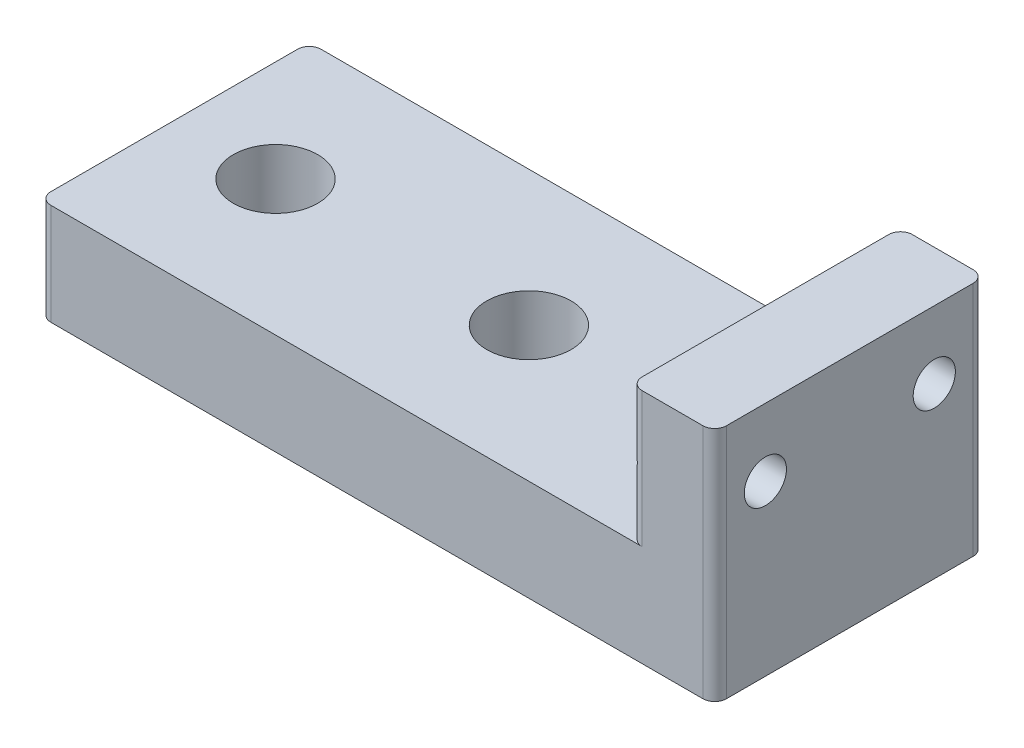
ISO-10303-21;
HEADER;
FILE_DESCRIPTION(('STEP AP214'),'2;1');
FILE_NAME('part.step','',(''),(''),'','','');
FILE_SCHEMA(('AUTOMOTIVE_DESIGN { 1 0 10303 214 1 1 1 1 }'));
ENDSEC;
DATA;
#1=APPLICATION_CONTEXT('core data for automotive mechanical design processes');
#2=APPLICATION_PROTOCOL_DEFINITION('international standard','automotive_design',2000,#1);
#3=PRODUCT_CONTEXT('',#1,'mechanical');
#4=PRODUCT('Part','Part','',(#3));
#5=PRODUCT_RELATED_PRODUCT_CATEGORY('part','',(#4));
#6=PRODUCT_DEFINITION_FORMATION('','',#4);
#7=PRODUCT_DEFINITION_CONTEXT('part definition',#1,'design');
#8=PRODUCT_DEFINITION('design','',#6,#7);
#9=PRODUCT_DEFINITION_SHAPE('','',#8);
#10=(LENGTH_UNIT() NAMED_UNIT(*) SI_UNIT(.MILLI.,.METRE.));
#11=(NAMED_UNIT(*) PLANE_ANGLE_UNIT() SI_UNIT($,.RADIAN.));
#12=(NAMED_UNIT(*) SI_UNIT($,.STERADIAN.) SOLID_ANGLE_UNIT());
#13=UNCERTAINTY_MEASURE_WITH_UNIT(LENGTH_MEASURE(1.E-05),#10,'distance_accuracy_value','');
#14=(GEOMETRIC_REPRESENTATION_CONTEXT(3) GLOBAL_UNCERTAINTY_ASSIGNED_CONTEXT((#13)) GLOBAL_UNIT_ASSIGNED_CONTEXT((#10,
#11,#12)) REPRESENTATION_CONTEXT('',''));
#15=CARTESIAN_POINT('',(0.,0.,0.));
#16=DIRECTION('',(0.,0.,1.));
#17=DIRECTION('',(1.,0.,0.));
#18=AXIS2_PLACEMENT_3D('',#15,#16,#17);
#19=CARTESIAN_POINT('',(49.,10.,-13.));
#20=DIRECTION('',(-1.,0.,0.));
#21=DIRECTION('',(0.,0.,1.));
#22=AXIS2_PLACEMENT_3D('',#19,#20,#21);
#23=CYLINDRICAL_SURFACE('',#22,1.25);
#24=CARTESIAN_POINT('',(40.,10.,-13.));
#25=DIRECTION('',(-1.,0.,0.));
#26=DIRECTION('',(0.,0.,1.));
#27=AXIS2_PLACEMENT_3D('',#24,#25,#26);
#28=CIRCLE('',#27,1.25);
#29=CARTESIAN_POINT('',(40.,10.,-11.75));
#30=VERTEX_POINT('',#29);
#31=EDGE_CURVE('E360',#30,#30,#28,.T.);
#32=ORIENTED_EDGE('',*,*,#31,.F.);
#33=EDGE_LOOP('',(#32));
#34=FACE_BOUND('',#33,.T.);
#35=CARTESIAN_POINT('',(38.,10.,-13.));
#36=DIRECTION('',(-1.,0.,0.));
#37=DIRECTION('',(0.,0.,1.));
#38=AXIS2_PLACEMENT_3D('',#35,#36,#37);
#39=CIRCLE('',#38,1.25);
#40=CARTESIAN_POINT('',(38.,10.,-11.75));
#41=VERTEX_POINT('',#40);
#42=EDGE_CURVE('E46',#41,#41,#39,.F.);
#43=ORIENTED_EDGE('',*,*,#42,.F.);
#44=EDGE_LOOP('',(#43));
#45=FACE_BOUND('',#44,.T.);
#46=ADVANCED_FACE('F42',(#34,#45),#23,.F.);
#47=CARTESIAN_POINT('',(49.,10.,-3.));
#48=DIRECTION('',(-1.,0.,0.));
#49=DIRECTION('',(0.,0.,1.));
#50=AXIS2_PLACEMENT_3D('',#47,#48,#49);
#51=CYLINDRICAL_SURFACE('',#50,1.25);
#52=CARTESIAN_POINT('',(40.,10.,-3.));
#53=DIRECTION('',(-1.,0.,0.));
#54=DIRECTION('',(0.,0.,1.));
#55=AXIS2_PLACEMENT_3D('',#52,#53,#54);
#56=CIRCLE('',#55,1.25);
#57=CARTESIAN_POINT('',(40.,10.,-1.75));
#58=VERTEX_POINT('',#57);
#59=EDGE_CURVE('E364',#58,#58,#56,.T.);
#60=ORIENTED_EDGE('',*,*,#59,.F.);
#61=EDGE_LOOP('',(#60));
#62=FACE_BOUND('',#61,.T.);
#63=CARTESIAN_POINT('',(38.,10.,-3.));
#64=DIRECTION('',(-1.,0.,0.));
#65=DIRECTION('',(0.,0.,1.));
#66=AXIS2_PLACEMENT_3D('',#63,#64,#65);
#67=CIRCLE('',#66,1.25);
#68=CARTESIAN_POINT('',(38.,10.,-1.75));
#69=VERTEX_POINT('',#68);
#70=EDGE_CURVE('E283',#69,#69,#67,.F.);
#71=ORIENTED_EDGE('',*,*,#70,.F.);
#72=EDGE_LOOP('',(#71));
#73=FACE_BOUND('',#72,.T.);
#74=ADVANCED_FACE('F530',(#62,#73),#51,.F.);
#75=CARTESIAN_POINT('',(0.,6.,0.));
#76=DIRECTION('',(0.,1.,0.));
#77=DIRECTION('',(0.,0.,1.));
#78=AXIS2_PLACEMENT_3D('',#75,#76,#77);
#79=PLANE('',#78);
#80=CARTESIAN_POINT('',(21.,6.,-8.));
#81=DIRECTION('',(0.,1.,0.));
#82=DIRECTION('',(0.,0.,1.));
#83=AXIS2_PLACEMENT_3D('',#80,#81,#82);
#84=CIRCLE('',#83,2.5);
#85=CARTESIAN_POINT('',(21.,6.,-5.5));
#86=VERTEX_POINT('',#85);
#87=EDGE_CURVE('E369',#86,#86,#84,.T.);
#88=ORIENTED_EDGE('',*,*,#87,.F.);
#89=EDGE_LOOP('',(#88));
#90=FACE_BOUND('',#89,.T.);
#91=CARTESIAN_POINT('',(6.,6.,-8.));
#92=DIRECTION('',(0.,1.,0.));
#93=DIRECTION('',(0.,0.,1.));
#94=AXIS2_PLACEMENT_3D('',#91,#92,#93);
#95=CIRCLE('',#94,2.5);
#96=CARTESIAN_POINT('',(6.,6.,-5.5));
#97=VERTEX_POINT('',#96);
#98=EDGE_CURVE('E368',#97,#97,#95,.T.);
#99=ORIENTED_EDGE('',*,*,#98,.F.);
#100=EDGE_LOOP('',(#99));
#101=FACE_BOUND('',#100,.T.);
#102=DIRECTION('',(1.,0.,0.));
#103=VECTOR('',#102,1.);
#104=CARTESIAN_POINT('',(0.,6.,-16.));
#105=LINE('',#104,#103);
#106=CARTESIAN_POINT('',(0.7,6.,-16.));
#107=VERTEX_POINT('',#106);
#108=CARTESIAN_POINT('',(35.7,6.,-16.));
#109=VERTEX_POINT('',#108);
#110=EDGE_CURVE('E402',#107,#109,#105,.T.);
#111=ORIENTED_EDGE('',*,*,#110,.F.);
#112=CARTESIAN_POINT('',(0.7,6.,-15.3));
#113=DIRECTION('',(0.,1.,0.));
#114=DIRECTION('',(0.,0.,1.));
#115=AXIS2_PLACEMENT_3D('',#112,#113,#114);
#116=CIRCLE('',#115,0.7);
#117=CARTESIAN_POINT('',(0.,6.,-15.3));
#118=VERTEX_POINT('',#117);
#119=EDGE_CURVE('E462',#107,#118,#116,.T.);
#120=ORIENTED_EDGE('',*,*,#119,.T.);
#121=DIRECTION('',(0.,0.,-1.));
#122=VECTOR('',#121,1.);
#123=CARTESIAN_POINT('',(0.,6.,0.));
#124=LINE('',#123,#122);
#125=CARTESIAN_POINT('',(0.,6.,-0.7));
#126=VERTEX_POINT('',#125);
#127=EDGE_CURVE('E406',#126,#118,#124,.T.);
#128=ORIENTED_EDGE('',*,*,#127,.F.);
#129=CARTESIAN_POINT('',(0.7,6.,-0.7));
#130=DIRECTION('',(0.,1.,0.));
#131=DIRECTION('',(0.,0.,1.));
#132=AXIS2_PLACEMENT_3D('',#129,#130,#131);
#133=CIRCLE('',#132,0.7);
#134=CARTESIAN_POINT('',(0.7,6.,0.));
#135=VERTEX_POINT('',#134);
#136=EDGE_CURVE('E459',#126,#135,#133,.T.);
#137=ORIENTED_EDGE('',*,*,#136,.T.);
#138=DIRECTION('',(1.,0.,0.));
#139=VECTOR('',#138,1.);
#140=CARTESIAN_POINT('',(0.,6.,0.));
#141=LINE('',#140,#139);
#142=CARTESIAN_POINT('',(35.7,6.,0.));
#143=VERTEX_POINT('',#142);
#144=EDGE_CURVE('E399',#135,#143,#141,.T.);
#145=ORIENTED_EDGE('',*,*,#144,.T.);
#146=CARTESIAN_POINT('',(35.7,6.,-0.7));
#147=DIRECTION('',(0.,1.,0.));
#148=DIRECTION('',(0.,0.,1.));
#149=AXIS2_PLACEMENT_3D('',#146,#147,#148);
#150=CIRCLE('',#149,0.7);
#151=CARTESIAN_POINT('',(35.,6.,-0.7));
#152=VERTEX_POINT('',#151);
#153=EDGE_CURVE('E509',#143,#152,#150,.F.);
#154=ORIENTED_EDGE('',*,*,#153,.T.);
#155=DIRECTION('',(0.,0.,-1.));
#156=VECTOR('',#155,1.);
#157=CARTESIAN_POINT('',(35.,6.,0.));
#158=LINE('',#157,#156);
#159=CARTESIAN_POINT('',(35.,6.,-15.3));
#160=VERTEX_POINT('',#159);
#161=EDGE_CURVE('E394',#152,#160,#158,.T.);
#162=ORIENTED_EDGE('',*,*,#161,.T.);
#163=CARTESIAN_POINT('',(35.7,6.,-15.3));
#164=DIRECTION('',(0.,1.,0.));
#165=DIRECTION('',(0.,0.,1.));
#166=AXIS2_PLACEMENT_3D('',#163,#164,#165);
#167=CIRCLE('',#166,0.7);
#168=EDGE_CURVE('E505',#160,#109,#167,.F.);
#169=ORIENTED_EDGE('',*,*,#168,.T.);
#170=EDGE_LOOP('',(#111,#120,#128,#137,#145,#154,#162,#169));
#171=FACE_BOUND('',#170,.T.);
#172=ADVANCED_FACE('F536',(#90,#101,#171),#79,.T.);
#173=CARTESIAN_POINT('',(0.,6.,0.));
#174=DIRECTION('',(0.,0.,-1.));
#175=DIRECTION('',(-1.,0.,0.));
#176=AXIS2_PLACEMENT_3D('',#173,#174,#175);
#177=PLANE('',#176);
#178=ORIENTED_EDGE('',*,*,#144,.F.);
#179=DIRECTION('',(0.,-1.,0.));
#180=VECTOR('',#179,1.);
#181=CARTESIAN_POINT('',(0.7,0.,0.));
#182=LINE('',#181,#180);
#183=CARTESIAN_POINT('',(0.7,0.,0.));
#184=VERTEX_POINT('',#183);
#185=EDGE_CURVE('E472',#135,#184,#182,.T.);
#186=ORIENTED_EDGE('',*,*,#185,.T.);
#187=DIRECTION('',(1.,0.,0.));
#188=VECTOR('',#187,1.);
#189=CARTESIAN_POINT('',(0.,0.,0.));
#190=LINE('',#189,#188);
#191=CARTESIAN_POINT('',(39.3,0.,0.));
#192=VERTEX_POINT('',#191);
#193=EDGE_CURVE('E398',#184,#192,#190,.T.);
#194=ORIENTED_EDGE('',*,*,#193,.T.);
#195=DIRECTION('',(0.,-1.,0.));
#196=VECTOR('',#195,1.);
#197=CARTESIAN_POINT('',(39.3,6.,0.));
#198=LINE('',#197,#196);
#199=CARTESIAN_POINT('',(39.3,14.,0.));
#200=VERTEX_POINT('',#199);
#201=EDGE_CURVE('E465',#192,#200,#198,.F.);
#202=ORIENTED_EDGE('',*,*,#201,.T.);
#203=DIRECTION('',(1.,0.,0.));
#204=VECTOR('',#203,1.);
#205=CARTESIAN_POINT('',(0.,14.,0.));
#206=LINE('',#205,#204);
#207=CARTESIAN_POINT('',(35.7,14.,0.));
#208=VERTEX_POINT('',#207);
#209=EDGE_CURVE('E386',#208,#200,#206,.T.);
#210=ORIENTED_EDGE('',*,*,#209,.F.);
#211=DIRECTION('',(0.,-1.,0.));
#212=VECTOR('',#211,1.);
#213=CARTESIAN_POINT('',(35.7,6.,0.));
#214=LINE('',#213,#212);
#215=EDGE_CURVE('E468',#208,#143,#214,.T.);
#216=ORIENTED_EDGE('',*,*,#215,.T.);
#217=EDGE_LOOP('',(#178,#186,#194,#202,#210,#216));
#218=FACE_BOUND('',#217,.T.);
#219=ADVANCED_FACE('F562',(#218),#177,.F.);
#220=CARTESIAN_POINT('',(40.,6.,0.));
#221=DIRECTION('',(-1.,0.,0.));
#222=DIRECTION('',(0.,0.,1.));
#223=AXIS2_PLACEMENT_3D('',#220,#221,#222);
#224=PLANE('',#223);
#225=ORIENTED_EDGE('',*,*,#59,.T.);
#226=EDGE_LOOP('',(#225));
#227=FACE_BOUND('',#226,.T.);
#228=ORIENTED_EDGE('',*,*,#31,.T.);
#229=EDGE_LOOP('',(#228));
#230=FACE_BOUND('',#229,.T.);
#231=DIRECTION('',(0.,0.,-1.));
#232=VECTOR('',#231,1.);
#233=CARTESIAN_POINT('',(40.,0.,0.));
#234=LINE('',#233,#232);
#235=CARTESIAN_POINT('',(40.,0.,-0.7));
#236=VERTEX_POINT('',#235);
#237=CARTESIAN_POINT('',(40.,0.,-15.3));
#238=VERTEX_POINT('',#237);
#239=EDGE_CURVE('E414',#236,#238,#234,.T.);
#240=ORIENTED_EDGE('',*,*,#239,.T.);
#241=DIRECTION('',(0.,-1.,0.));
#242=VECTOR('',#241,1.);
#243=CARTESIAN_POINT('',(40.,14.,-15.3));
#244=LINE('',#243,#242);
#245=CARTESIAN_POINT('',(40.,14.,-15.3));
#246=VERTEX_POINT('',#245);
#247=EDGE_CURVE('E502',#238,#246,#244,.F.);
#248=ORIENTED_EDGE('',*,*,#247,.T.);
#249=DIRECTION('',(0.,0.,-1.));
#250=VECTOR('',#249,1.);
#251=CARTESIAN_POINT('',(40.,14.,0.));
#252=LINE('',#251,#250);
#253=CARTESIAN_POINT('',(40.,14.,-0.7));
#254=VERTEX_POINT('',#253);
#255=EDGE_CURVE('E390',#254,#246,#252,.T.);
#256=ORIENTED_EDGE('',*,*,#255,.F.);
#257=DIRECTION('',(0.,-1.,0.));
#258=VECTOR('',#257,1.);
#259=CARTESIAN_POINT('',(40.,6.,-0.7));
#260=LINE('',#259,#258);
#261=EDGE_CURVE('E498',#254,#236,#260,.T.);
#262=ORIENTED_EDGE('',*,*,#261,.T.);
#263=EDGE_LOOP('',(#240,#248,#256,#262));
#264=FACE_BOUND('',#263,.T.);
#265=ADVANCED_FACE('F574',(#227,#230,#264),#224,.F.);
#266=CARTESIAN_POINT('',(0.,6.,-16.));
#267=DIRECTION('',(0.,0.,-1.));
#268=DIRECTION('',(-1.,0.,0.));
#269=AXIS2_PLACEMENT_3D('',#266,#267,#268);
#270=PLANE('',#269);
#271=DIRECTION('',(1.,0.,0.));
#272=VECTOR('',#271,1.);
#273=CARTESIAN_POINT('',(0.,0.,-16.));
#274=LINE('',#273,#272);
#275=CARTESIAN_POINT('',(0.7,0.,-16.));
#276=VERTEX_POINT('',#275);
#277=CARTESIAN_POINT('',(39.3,0.,-16.));
#278=VERTEX_POINT('',#277);
#279=EDGE_CURVE('E418',#276,#278,#274,.T.);
#280=ORIENTED_EDGE('',*,*,#279,.F.);
#281=DIRECTION('',(0.,-1.,0.));
#282=VECTOR('',#281,1.);
#283=CARTESIAN_POINT('',(0.7,6.,-16.));
#284=LINE('',#283,#282);
#285=EDGE_CURVE('E456',#276,#107,#284,.F.);
#286=ORIENTED_EDGE('',*,*,#285,.T.);
#287=ORIENTED_EDGE('',*,*,#110,.T.);
#288=DIRECTION('',(0.,-1.,0.));
#289=VECTOR('',#288,1.);
#290=CARTESIAN_POINT('',(35.7,14.,-16.));
#291=LINE('',#290,#289);
#292=CARTESIAN_POINT('',(35.7,14.,-16.));
#293=VERTEX_POINT('',#292);
#294=EDGE_CURVE('E453',#109,#293,#291,.F.);
#295=ORIENTED_EDGE('',*,*,#294,.T.);
#296=DIRECTION('',(1.,0.,0.));
#297=VECTOR('',#296,1.);
#298=CARTESIAN_POINT('',(0.,14.,-16.));
#299=LINE('',#298,#297);
#300=CARTESIAN_POINT('',(39.3,14.,-16.));
#301=VERTEX_POINT('',#300);
#302=EDGE_CURVE('E377',#293,#301,#299,.T.);
#303=ORIENTED_EDGE('',*,*,#302,.T.);
#304=DIRECTION('',(0.,-1.,0.));
#305=VECTOR('',#304,1.);
#306=CARTESIAN_POINT('',(39.3,0.,-16.));
#307=LINE('',#306,#305);
#308=EDGE_CURVE('E449',#301,#278,#307,.T.);
#309=ORIENTED_EDGE('',*,*,#308,.T.);
#310=EDGE_LOOP('',(#280,#286,#287,#295,#303,#309));
#311=FACE_BOUND('',#310,.T.);
#312=ADVANCED_FACE('F570',(#311),#270,.T.);
#313=CARTESIAN_POINT('',(0.,6.,0.));
#314=DIRECTION('',(-1.,0.,0.));
#315=DIRECTION('',(0.,0.,1.));
#316=AXIS2_PLACEMENT_3D('',#313,#314,#315);
#317=PLANE('',#316);
#318=ORIENTED_EDGE('',*,*,#127,.T.);
#319=DIRECTION('',(0.,-1.,0.));
#320=VECTOR('',#319,1.);
#321=CARTESIAN_POINT('',(0.,6.,-15.3));
#322=LINE('',#321,#320);
#323=CARTESIAN_POINT('',(0.,0.,-15.3));
#324=VERTEX_POINT('',#323);
#325=EDGE_CURVE('E433',#118,#324,#322,.T.);
#326=ORIENTED_EDGE('',*,*,#325,.T.);
#327=DIRECTION('',(0.,0.,-1.));
#328=VECTOR('',#327,1.);
#329=CARTESIAN_POINT('',(0.,0.,0.));
#330=LINE('',#329,#328);
#331=CARTESIAN_POINT('',(0.,0.,-0.7));
#332=VERTEX_POINT('',#331);
#333=EDGE_CURVE('E403',#332,#324,#330,.T.);
#334=ORIENTED_EDGE('',*,*,#333,.F.);
#335=DIRECTION('',(0.,-1.,0.));
#336=VECTOR('',#335,1.);
#337=CARTESIAN_POINT('',(0.,6.,-0.7));
#338=LINE('',#337,#336);
#339=EDGE_CURVE('E410',#332,#126,#338,.F.);
#340=ORIENTED_EDGE('',*,*,#339,.T.);
#341=EDGE_LOOP('',(#318,#326,#334,#340));
#342=FACE_BOUND('',#341,.T.);
#343=ADVANCED_FACE('F566',(#342),#317,.T.);
#344=CARTESIAN_POINT('',(0.,0.,0.));
#345=DIRECTION('',(0.,1.,0.));
#346=DIRECTION('',(0.,0.,1.));
#347=AXIS2_PLACEMENT_3D('',#344,#345,#346);
#348=PLANE('',#347);
#349=CARTESIAN_POINT('',(21.,0.,-8.));
#350=DIRECTION('',(0.,1.,0.));
#351=DIRECTION('',(0.,0.,1.));
#352=AXIS2_PLACEMENT_3D('',#349,#350,#351);
#353=CIRCLE('',#352,2.5);
#354=CARTESIAN_POINT('',(21.,0.,-5.5));
#355=VERTEX_POINT('',#354);
#356=EDGE_CURVE('E382',#355,#355,#353,.T.);
#357=ORIENTED_EDGE('',*,*,#356,.T.);
#358=EDGE_LOOP('',(#357));
#359=FACE_BOUND('',#358,.T.);
#360=CARTESIAN_POINT('',(6.,0.,-8.));
#361=DIRECTION('',(0.,1.,0.));
#362=DIRECTION('',(0.,0.,1.));
#363=AXIS2_PLACEMENT_3D('',#360,#361,#362);
#364=CIRCLE('',#363,2.5);
#365=CARTESIAN_POINT('',(6.,0.,-5.5));
#366=VERTEX_POINT('',#365);
#367=EDGE_CURVE('E373',#366,#366,#364,.T.);
#368=ORIENTED_EDGE('',*,*,#367,.T.);
#369=EDGE_LOOP('',(#368));
#370=FACE_BOUND('',#369,.T.);
#371=ORIENTED_EDGE('',*,*,#333,.T.);
#372=CARTESIAN_POINT('',(0.7,0.,-15.3));
#373=DIRECTION('',(0.,1.,0.));
#374=DIRECTION('',(0.,0.,1.));
#375=AXIS2_PLACEMENT_3D('',#372,#373,#374);
#376=CIRCLE('',#375,0.7);
#377=EDGE_CURVE('E446',#324,#276,#376,.F.);
#378=ORIENTED_EDGE('',*,*,#377,.T.);
#379=ORIENTED_EDGE('',*,*,#279,.T.);
#380=CARTESIAN_POINT('',(39.3,0.,-15.3));
#381=DIRECTION('',(0.,1.,0.));
#382=DIRECTION('',(0.,0.,1.));
#383=AXIS2_PLACEMENT_3D('',#380,#381,#382);
#384=CIRCLE('',#383,0.7);
#385=EDGE_CURVE('E440',#278,#238,#384,.F.);
#386=ORIENTED_EDGE('',*,*,#385,.T.);
#387=ORIENTED_EDGE('',*,*,#239,.F.);
#388=CARTESIAN_POINT('',(39.3,0.,-0.7));
#389=DIRECTION('',(0.,1.,0.));
#390=DIRECTION('',(0.,0.,1.));
#391=AXIS2_PLACEMENT_3D('',#388,#389,#390);
#392=CIRCLE('',#391,0.7);
#393=EDGE_CURVE('E437',#236,#192,#392,.F.);
#394=ORIENTED_EDGE('',*,*,#393,.T.);
#395=ORIENTED_EDGE('',*,*,#193,.F.);
#396=CARTESIAN_POINT('',(0.7,0.,-0.7));
#397=DIRECTION('',(0.,1.,0.));
#398=DIRECTION('',(0.,0.,1.));
#399=AXIS2_PLACEMENT_3D('',#396,#397,#398);
#400=CIRCLE('',#399,0.7);
#401=EDGE_CURVE('E443',#184,#332,#400,.F.);
#402=ORIENTED_EDGE('',*,*,#401,.T.);
#403=EDGE_LOOP('',(#371,#378,#379,#386,#387,#394,#395,#402));
#404=FACE_BOUND('',#403,.T.);
#405=ADVANCED_FACE('F558',(#359,#370,#404),#348,.F.);
#406=CARTESIAN_POINT('',(35.,14.,0.));
#407=DIRECTION('',(1.,0.,0.));
#408=DIRECTION('',(0.,0.,-1.));
#409=AXIS2_PLACEMENT_3D('',#406,#407,#408);
#410=PLANE('',#409);
#411=DIRECTION('',(0.,0.,1.));
#412=VECTOR('',#411,1.);
#413=CARTESIAN_POINT('',(35.,7.5,-14.4433756729741));
#414=LINE('',#413,#412);
#415=CARTESIAN_POINT('',(35.,7.5,-14.4433756729741));
#416=VERTEX_POINT('',#415);
#417=CARTESIAN_POINT('',(35.,7.5,-11.5566243270259));
#418=VERTEX_POINT('',#417);
#419=EDGE_CURVE('E253',#416,#418,#414,.T.);
#420=ORIENTED_EDGE('',*,*,#419,.F.);
#421=DIRECTION('',(0.,-0.866025403784438,0.5));
#422=VECTOR('',#421,1.);
#423=CARTESIAN_POINT('',(35.,10.,-15.8867513459481));
#424=LINE('',#423,#422);
#425=CARTESIAN_POINT('',(35.,8.98371685740842,-15.3));
#426=VERTEX_POINT('',#425);
#427=EDGE_CURVE('E274',#426,#416,#424,.T.);
#428=ORIENTED_EDGE('',*,*,#427,.F.);
#429=DIRECTION('',(0.,-1.,0.));
#430=VECTOR('',#429,1.);
#431=CARTESIAN_POINT('',(35.,6.,-15.3));
#432=LINE('',#431,#430);
#433=EDGE_CURVE('E481',#426,#160,#432,.T.);
#434=ORIENTED_EDGE('',*,*,#433,.T.);
#435=ORIENTED_EDGE('',*,*,#161,.F.);
#436=DIRECTION('',(0.,-1.,0.));
#437=VECTOR('',#436,1.);
#438=CARTESIAN_POINT('',(35.,14.,-0.7));
#439=LINE('',#438,#437);
#440=CARTESIAN_POINT('',(35.,8.9837168574084,-0.7));
#441=VERTEX_POINT('',#440);
#442=EDGE_CURVE('E477',#152,#441,#439,.F.);
#443=ORIENTED_EDGE('',*,*,#442,.T.);
#444=DIRECTION('',(0.,0.866025403784439,0.5));
#445=VECTOR('',#444,1.);
#446=CARTESIAN_POINT('',(35.,7.5,-1.55662432702593));
#447=LINE('',#446,#445);
#448=CARTESIAN_POINT('',(35.,7.5,-1.55662432702593));
#449=VERTEX_POINT('',#448);
#450=EDGE_CURVE('E68',#449,#441,#447,.T.);
#451=ORIENTED_EDGE('',*,*,#450,.F.);
#452=DIRECTION('',(0.,0.,1.));
#453=VECTOR('',#452,1.);
#454=CARTESIAN_POINT('',(35.,7.49999999999999,-4.44337567297406));
#455=LINE('',#454,#453);
#456=CARTESIAN_POINT('',(35.,7.49999999999999,-4.44337567297406));
#457=VERTEX_POINT('',#456);
#458=EDGE_CURVE('E335',#457,#449,#455,.T.);
#459=ORIENTED_EDGE('',*,*,#458,.F.);
#460=DIRECTION('',(0.,-0.866025403784439,0.5));
#461=VECTOR('',#460,1.);
#462=CARTESIAN_POINT('',(35.,10.,-5.88675134594813));
#463=LINE('',#462,#461);
#464=CARTESIAN_POINT('',(35.,10.,-5.88675134594813));
#465=VERTEX_POINT('',#464);
#466=EDGE_CURVE('E331',#465,#457,#463,.T.);
#467=ORIENTED_EDGE('',*,*,#466,.F.);
#468=DIRECTION('',(0.,-0.866025403784439,-0.5));
#469=VECTOR('',#468,1.);
#470=CARTESIAN_POINT('',(35.,12.5,-4.44337567297406));
#471=LINE('',#470,#469);
#472=CARTESIAN_POINT('',(35.,12.5,-4.44337567297406));
#473=VERTEX_POINT('',#472);
#474=EDGE_CURVE('E327',#473,#465,#471,.T.);
#475=ORIENTED_EDGE('',*,*,#474,.F.);
#476=DIRECTION('',(0.,0.,-1.));
#477=VECTOR('',#476,1.);
#478=CARTESIAN_POINT('',(35.,12.5,-1.55662432702593));
#479=LINE('',#478,#477);
#480=CARTESIAN_POINT('',(35.,12.5,-1.55662432702593));
#481=VERTEX_POINT('',#480);
#482=EDGE_CURVE('E323',#481,#473,#479,.T.);
#483=ORIENTED_EDGE('',*,*,#482,.F.);
#484=DIRECTION('',(0.,0.866025403784438,-0.500000000000001));
#485=VECTOR('',#484,1.);
#486=CARTESIAN_POINT('',(35.,10.,-0.113248654051863));
#487=LINE('',#486,#485);
#488=CARTESIAN_POINT('',(35.,11.0162831425916,-0.7));
#489=VERTEX_POINT('',#488);
#490=EDGE_CURVE('E302',#489,#481,#487,.T.);
#491=ORIENTED_EDGE('',*,*,#490,.F.);
#492=CARTESIAN_POINT('',(35.,14.,-0.7));
#493=VERTEX_POINT('',#492);
#494=EDGE_CURVE('E476',#489,#493,#439,.F.);
#495=ORIENTED_EDGE('',*,*,#494,.T.);
#496=DIRECTION('',(0.,0.,1.));
#497=VECTOR('',#496,1.);
#498=CARTESIAN_POINT('',(35.,14.,0.));
#499=LINE('',#498,#497);
#500=CARTESIAN_POINT('',(35.,14.,-15.3));
#501=VERTEX_POINT('',#500);
#502=EDGE_CURVE('E381',#501,#493,#499,.T.);
#503=ORIENTED_EDGE('',*,*,#502,.F.);
#504=CARTESIAN_POINT('',(35.,11.0162831425916,-15.3));
#505=VERTEX_POINT('',#504);
#506=EDGE_CURVE('E482',#501,#505,#432,.T.);
#507=ORIENTED_EDGE('',*,*,#506,.T.);
#508=DIRECTION('',(0.,-0.866025403784438,-0.5));
#509=VECTOR('',#508,1.);
#510=CARTESIAN_POINT('',(35.,12.5,-14.4433756729741));
#511=LINE('',#510,#509);
#512=CARTESIAN_POINT('',(35.,12.5,-14.4433756729741));
#513=VERTEX_POINT('',#512);
#514=EDGE_CURVE('E60',#513,#505,#511,.T.);
#515=ORIENTED_EDGE('',*,*,#514,.F.);
#516=DIRECTION('',(0.,0.,-1.));
#517=VECTOR('',#516,1.);
#518=CARTESIAN_POINT('',(35.,12.5,-11.5566243270259));
#519=LINE('',#518,#517);
#520=CARTESIAN_POINT('',(35.,12.5,-11.5566243270259));
#521=VERTEX_POINT('',#520);
#522=EDGE_CURVE('E268',#521,#513,#519,.T.);
#523=ORIENTED_EDGE('',*,*,#522,.F.);
#524=DIRECTION('',(0.,0.866025403784438,-0.5));
#525=VECTOR('',#524,1.);
#526=CARTESIAN_POINT('',(35.,10.,-10.1132486540519));
#527=LINE('',#526,#525);
#528=CARTESIAN_POINT('',(35.,10.,-10.1132486540519));
#529=VERTEX_POINT('',#528);
#530=EDGE_CURVE('E224',#529,#521,#527,.T.);
#531=ORIENTED_EDGE('',*,*,#530,.F.);
#532=DIRECTION('',(0.,0.866025403784439,0.5));
#533=VECTOR('',#532,1.);
#534=CARTESIAN_POINT('',(35.,7.5,-11.5566243270259));
#535=LINE('',#534,#533);
#536=EDGE_CURVE('E246',#418,#529,#535,.T.);
#537=ORIENTED_EDGE('',*,*,#536,.F.);
#538=EDGE_LOOP('',(#420,#428,#434,#435,#443,#451,#459,#467,#475,#483,#491,#495,#503,#507,#515,
#523,#531,#537));
#539=FACE_BOUND('',#538,.T.);
#540=ADVANCED_FACE('F554',(#539),#410,.F.);
#541=CARTESIAN_POINT('',(0.,14.,0.));
#542=DIRECTION('',(0.,1.,0.));
#543=DIRECTION('',(0.,0.,1.));
#544=AXIS2_PLACEMENT_3D('',#541,#542,#543);
#545=PLANE('',#544);
#546=ORIENTED_EDGE('',*,*,#302,.F.);
#547=CARTESIAN_POINT('',(35.7,14.,-15.3));
#548=DIRECTION('',(0.,1.,0.));
#549=DIRECTION('',(0.,0.,1.));
#550=AXIS2_PLACEMENT_3D('',#547,#548,#549);
#551=CIRCLE('',#550,0.7);
#552=EDGE_CURVE('E495',#293,#501,#551,.T.);
#553=ORIENTED_EDGE('',*,*,#552,.T.);
#554=ORIENTED_EDGE('',*,*,#502,.T.);
#555=CARTESIAN_POINT('',(35.7,14.,-0.7));
#556=DIRECTION('',(0.,1.,0.));
#557=DIRECTION('',(0.,0.,1.));
#558=AXIS2_PLACEMENT_3D('',#555,#556,#557);
#559=CIRCLE('',#558,0.7);
#560=EDGE_CURVE('E489',#493,#208,#559,.T.);
#561=ORIENTED_EDGE('',*,*,#560,.T.);
#562=ORIENTED_EDGE('',*,*,#209,.T.);
#563=CARTESIAN_POINT('',(39.3,14.,-0.7));
#564=DIRECTION('',(0.,1.,0.));
#565=DIRECTION('',(0.,0.,1.));
#566=AXIS2_PLACEMENT_3D('',#563,#564,#565);
#567=CIRCLE('',#566,0.7);
#568=EDGE_CURVE('E486',#200,#254,#567,.T.);
#569=ORIENTED_EDGE('',*,*,#568,.T.);
#570=ORIENTED_EDGE('',*,*,#255,.T.);
#571=CARTESIAN_POINT('',(39.3,14.,-15.3));
#572=DIRECTION('',(0.,1.,0.));
#573=DIRECTION('',(0.,0.,1.));
#574=AXIS2_PLACEMENT_3D('',#571,#572,#573);
#575=CIRCLE('',#574,0.7);
#576=EDGE_CURVE('E492',#246,#301,#575,.T.);
#577=ORIENTED_EDGE('',*,*,#576,.T.);
#578=EDGE_LOOP('',(#546,#553,#554,#561,#562,#569,#570,#577));
#579=FACE_BOUND('',#578,.T.);
#580=ADVANCED_FACE('F550',(#579),#545,.T.);
#581=CARTESIAN_POINT('',(6.,-8.,-8.));
#582=DIRECTION('',(0.,1.,0.));
#583=DIRECTION('',(0.,0.,1.));
#584=AXIS2_PLACEMENT_3D('',#581,#582,#583);
#585=CYLINDRICAL_SURFACE('',#584,2.5);
#586=ORIENTED_EDGE('',*,*,#98,.T.);
#587=EDGE_LOOP('',(#586));
#588=FACE_BOUND('',#587,.T.);
#589=ORIENTED_EDGE('',*,*,#367,.F.);
#590=EDGE_LOOP('',(#589));
#591=FACE_BOUND('',#590,.T.);
#592=ADVANCED_FACE('F546',(#588,#591),#585,.F.);
#593=CARTESIAN_POINT('',(21.,-8.,-8.));
#594=DIRECTION('',(0.,1.,0.));
#595=DIRECTION('',(0.,0.,1.));
#596=AXIS2_PLACEMENT_3D('',#593,#594,#595);
#597=CYLINDRICAL_SURFACE('',#596,2.5);
#598=ORIENTED_EDGE('',*,*,#87,.T.);
#599=EDGE_LOOP('',(#598));
#600=FACE_BOUND('',#599,.T.);
#601=ORIENTED_EDGE('',*,*,#356,.F.);
#602=EDGE_LOOP('',(#601));
#603=FACE_BOUND('',#602,.T.);
#604=ADVANCED_FACE('F542',(#600,#603),#597,.F.);
#605=CARTESIAN_POINT('',(0.7,6.,-15.3));
#606=DIRECTION('',(0.,-1.,0.));
#607=DIRECTION('',(0.,0.,-1.));
#608=AXIS2_PLACEMENT_3D('',#605,#606,#607);
#609=CYLINDRICAL_SURFACE('',#608,0.7);
#610=ORIENTED_EDGE('',*,*,#119,.F.);
#611=ORIENTED_EDGE('',*,*,#285,.F.);
#612=ORIENTED_EDGE('',*,*,#377,.F.);
#613=ORIENTED_EDGE('',*,*,#325,.F.);
#614=EDGE_LOOP('',(#610,#611,#612,#613));
#615=FACE_BOUND('',#614,.T.);
#616=ADVANCED_FACE('F545',(#615),#609,.T.);
#617=CARTESIAN_POINT('',(0.7,6.,-0.7));
#618=DIRECTION('',(0.,1.,0.));
#619=DIRECTION('',(0.,0.,1.));
#620=AXIS2_PLACEMENT_3D('',#617,#618,#619);
#621=CYLINDRICAL_SURFACE('',#620,0.7);
#622=ORIENTED_EDGE('',*,*,#136,.F.);
#623=ORIENTED_EDGE('',*,*,#339,.F.);
#624=ORIENTED_EDGE('',*,*,#401,.F.);
#625=ORIENTED_EDGE('',*,*,#185,.F.);
#626=EDGE_LOOP('',(#622,#623,#624,#625));
#627=FACE_BOUND('',#626,.T.);
#628=ADVANCED_FACE('F584',(#627),#621,.T.);
#629=CARTESIAN_POINT('',(35.7,14.,-15.3));
#630=DIRECTION('',(0.,1.,0.));
#631=DIRECTION('',(0.,0.,1.));
#632=AXIS2_PLACEMENT_3D('',#629,#630,#631);
#633=CYLINDRICAL_SURFACE('',#632,0.7);
#634=CARTESIAN_POINT('',(35.7,8.98371685740842,-15.3));
#635=DIRECTION('',(0.,-0.5,-0.866025403784439));
#636=DIRECTION('',(0.,0.866025403784439,-0.5));
#637=AXIS2_PLACEMENT_3D('',#634,#635,#636);
#638=ELLIPSE('',#637,1.4,0.7);
#639=CARTESIAN_POINT('',(35.3182633656196,10.,-15.8867513459481));
#640=VERTEX_POINT('',#639);
#641=EDGE_CURVE('E11',#640,#426,#638,.F.);
#642=ORIENTED_EDGE('',*,*,#641,.F.);
#643=CARTESIAN_POINT('',(35.7,11.0162831425916,-15.3));
#644=DIRECTION('',(0.,0.5,-0.866025403784439));
#645=DIRECTION('',(0.,0.866025403784439,0.5));
#646=AXIS2_PLACEMENT_3D('',#643,#644,#645);
#647=ELLIPSE('',#646,1.4,0.7);
#648=EDGE_CURVE('E52',#505,#640,#647,.F.);
#649=ORIENTED_EDGE('',*,*,#648,.F.);
#650=ORIENTED_EDGE('',*,*,#506,.F.);
#651=ORIENTED_EDGE('',*,*,#552,.F.);
#652=ORIENTED_EDGE('',*,*,#294,.F.);
#653=ORIENTED_EDGE('',*,*,#168,.F.);
#654=ORIENTED_EDGE('',*,*,#433,.F.);
#655=EDGE_LOOP('',(#642,#649,#650,#651,#652,#653,#654));
#656=FACE_BOUND('',#655,.T.);
#657=ADVANCED_FACE('F588',(#656),#633,.T.);
#658=CARTESIAN_POINT('',(39.3,6.,-15.3));
#659=DIRECTION('',(0.,1.,0.));
#660=DIRECTION('',(0.,0.,1.));
#661=AXIS2_PLACEMENT_3D('',#658,#659,#660);
#662=CYLINDRICAL_SURFACE('',#661,0.7);
#663=ORIENTED_EDGE('',*,*,#576,.F.);
#664=ORIENTED_EDGE('',*,*,#247,.F.);
#665=ORIENTED_EDGE('',*,*,#385,.F.);
#666=ORIENTED_EDGE('',*,*,#308,.F.);
#667=EDGE_LOOP('',(#663,#664,#665,#666));
#668=FACE_BOUND('',#667,.T.);
#669=ADVANCED_FACE('F592',(#668),#662,.T.);
#670=CARTESIAN_POINT('',(35.7,6.,-0.7));
#671=DIRECTION('',(0.,-1.,0.));
#672=DIRECTION('',(0.,0.,-1.));
#673=AXIS2_PLACEMENT_3D('',#670,#671,#672);
#674=CYLINDRICAL_SURFACE('',#673,0.7);
#675=CARTESIAN_POINT('',(35.7,11.0162831425916,-0.7));
#676=DIRECTION('',(0.,0.500000000000001,0.866025403784438));
#677=DIRECTION('',(0.,-0.866025403784438,0.500000000000001));
#678=AXIS2_PLACEMENT_3D('',#675,#676,#677);
#679=ELLIPSE('',#678,1.4,0.7);
#680=CARTESIAN_POINT('',(35.3182633656196,10.,-0.113248654051863));
#681=VERTEX_POINT('',#680);
#682=EDGE_CURVE('E515',#681,#489,#679,.F.);
#683=ORIENTED_EDGE('',*,*,#682,.F.);
#684=CARTESIAN_POINT('',(35.7,8.9837168574084,-0.7));
#685=DIRECTION('',(0.,-0.5,0.866025403784438));
#686=DIRECTION('',(0.,-0.866025403784439,-0.5));
#687=AXIS2_PLACEMENT_3D('',#684,#685,#686);
#688=ELLIPSE('',#687,1.4,0.7);
#689=EDGE_CURVE('E512',#441,#681,#688,.F.);
#690=ORIENTED_EDGE('',*,*,#689,.F.);
#691=ORIENTED_EDGE('',*,*,#442,.F.);
#692=ORIENTED_EDGE('',*,*,#153,.F.);
#693=ORIENTED_EDGE('',*,*,#215,.F.);
#694=ORIENTED_EDGE('',*,*,#560,.F.);
#695=ORIENTED_EDGE('',*,*,#494,.F.);
#696=EDGE_LOOP('',(#683,#690,#691,#692,#693,#694,#695));
#697=FACE_BOUND('',#696,.T.);
#698=ADVANCED_FACE('F595',(#697),#674,.T.);
#699=CARTESIAN_POINT('',(39.3,6.,-0.7));
#700=DIRECTION('',(0.,-1.,0.));
#701=DIRECTION('',(0.,0.,-1.));
#702=AXIS2_PLACEMENT_3D('',#699,#700,#701);
#703=CYLINDRICAL_SURFACE('',#702,0.7);
#704=ORIENTED_EDGE('',*,*,#568,.F.);
#705=ORIENTED_EDGE('',*,*,#201,.F.);
#706=ORIENTED_EDGE('',*,*,#393,.F.);
#707=ORIENTED_EDGE('',*,*,#261,.F.);
#708=EDGE_LOOP('',(#704,#705,#706,#707));
#709=FACE_BOUND('',#708,.T.);
#710=ADVANCED_FACE('F44',(#709),#703,.T.);
#711=CARTESIAN_POINT('',(38.,0.,0.));
#712=DIRECTION('',(-1.,0.,0.));
#713=DIRECTION('',(0.,0.,1.));
#714=AXIS2_PLACEMENT_3D('',#711,#712,#713);
#715=PLANE('',#714);
#716=DIRECTION('',(0.,0.,-1.));
#717=VECTOR('',#716,1.);
#718=CARTESIAN_POINT('',(38.,12.5,-1.55662432702593));
#719=LINE('',#718,#717);
#720=CARTESIAN_POINT('',(38.,12.5,-1.55662432702593));
#721=VERTEX_POINT('',#720);
#722=CARTESIAN_POINT('',(38.,12.5,-4.44337567297406));
#723=VERTEX_POINT('',#722);
#724=EDGE_CURVE('E297',#721,#723,#719,.T.);
#725=ORIENTED_EDGE('',*,*,#724,.T.);
#726=DIRECTION('',(0.,-0.866025403784439,-0.5));
#727=VECTOR('',#726,1.);
#728=CARTESIAN_POINT('',(38.,12.5,-4.44337567297406));
#729=LINE('',#728,#727);
#730=CARTESIAN_POINT('',(38.,10.,-5.88675134594813));
#731=VERTEX_POINT('',#730);
#732=EDGE_CURVE('E301',#723,#731,#729,.T.);
#733=ORIENTED_EDGE('',*,*,#732,.T.);
#734=DIRECTION('',(0.,-0.866025403784439,0.5));
#735=VECTOR('',#734,1.);
#736=CARTESIAN_POINT('',(38.,10.,-5.88675134594813));
#737=LINE('',#736,#735);
#738=CARTESIAN_POINT('',(38.,7.49999999999999,-4.44337567297406));
#739=VERTEX_POINT('',#738);
#740=EDGE_CURVE('E306',#731,#739,#737,.T.);
#741=ORIENTED_EDGE('',*,*,#740,.T.);
#742=DIRECTION('',(0.,0.,1.));
#743=VECTOR('',#742,1.);
#744=CARTESIAN_POINT('',(38.,7.49999999999999,-4.44337567297406));
#745=LINE('',#744,#743);
#746=CARTESIAN_POINT('',(38.,7.5,-1.55662432702593));
#747=VERTEX_POINT('',#746);
#748=EDGE_CURVE('E310',#739,#747,#745,.T.);
#749=ORIENTED_EDGE('',*,*,#748,.T.);
#750=DIRECTION('',(0.,0.866025403784439,0.5));
#751=VECTOR('',#750,1.);
#752=CARTESIAN_POINT('',(38.,7.5,-1.55662432702593));
#753=LINE('',#752,#751);
#754=CARTESIAN_POINT('',(38.,10.,-0.113248654051863));
#755=VERTEX_POINT('',#754);
#756=EDGE_CURVE('E314',#747,#755,#753,.T.);
#757=ORIENTED_EDGE('',*,*,#756,.T.);
#758=DIRECTION('',(0.,0.866025403784438,-0.500000000000001));
#759=VECTOR('',#758,1.);
#760=CARTESIAN_POINT('',(38.,10.,-0.113248654051863));
#761=LINE('',#760,#759);
#762=EDGE_CURVE('E318',#755,#721,#761,.T.);
#763=ORIENTED_EDGE('',*,*,#762,.T.);
#764=EDGE_LOOP('',(#725,#733,#741,#749,#757,#763));
#765=FACE_BOUND('',#764,.T.);
#766=ORIENTED_EDGE('',*,*,#70,.T.);
#767=EDGE_LOOP('',(#766));
#768=FACE_BOUND('',#767,.T.);
#769=ADVANCED_FACE('F602',(#765,#768),#715,.T.);
#770=CARTESIAN_POINT('',(38.,12.5,-1.55662432702593));
#771=DIRECTION('',(0.,1.,0.));
#772=DIRECTION('',(0.,0.,1.));
#773=AXIS2_PLACEMENT_3D('',#770,#771,#772);
#774=PLANE('',#773);
#775=ORIENTED_EDGE('',*,*,#482,.T.);
#776=DIRECTION('',(-1.,0.,0.));
#777=VECTOR('',#776,1.);
#778=CARTESIAN_POINT('',(38.,12.5,-4.44337567297406));
#779=LINE('',#778,#777);
#780=EDGE_CURVE('E322',#723,#473,#779,.T.);
#781=ORIENTED_EDGE('',*,*,#780,.F.);
#782=ORIENTED_EDGE('',*,*,#724,.F.);
#783=DIRECTION('',(-1.,0.,0.));
#784=VECTOR('',#783,1.);
#785=CARTESIAN_POINT('',(38.,12.5,-1.55662432702593));
#786=LINE('',#785,#784);
#787=EDGE_CURVE('E269',#721,#481,#786,.T.);
#788=ORIENTED_EDGE('',*,*,#787,.T.);
#789=EDGE_LOOP('',(#775,#781,#782,#788));
#790=FACE_BOUND('',#789,.T.);
#791=ADVANCED_FACE('F618',(#790),#774,.F.);
#792=CARTESIAN_POINT('',(38.,10.,-0.113248654051863));
#793=DIRECTION('',(0.,0.500000000000001,0.866025403784438));
#794=DIRECTION('',(0.,-0.866025403784438,0.500000000000001));
#795=AXIS2_PLACEMENT_3D('',#792,#793,#794);
#796=PLANE('',#795);
#797=ORIENTED_EDGE('',*,*,#682,.T.);
#798=ORIENTED_EDGE('',*,*,#490,.T.);
#799=ORIENTED_EDGE('',*,*,#787,.F.);
#800=ORIENTED_EDGE('',*,*,#762,.F.);
#801=DIRECTION('',(-1.,0.,0.));
#802=VECTOR('',#801,1.);
#803=CARTESIAN_POINT('',(38.,10.,-0.113248654051863));
#804=LINE('',#803,#802);
#805=EDGE_CURVE('E346',#755,#681,#804,.T.);
#806=ORIENTED_EDGE('',*,*,#805,.T.);
#807=EDGE_LOOP('',(#797,#798,#799,#800,#806));
#808=FACE_BOUND('',#807,.T.);
#809=ADVANCED_FACE('F610',(#808),#796,.F.);
#810=CARTESIAN_POINT('',(38.,7.5,-1.55662432702593));
#811=DIRECTION('',(0.,-0.5,0.866025403784438));
#812=DIRECTION('',(0.,-0.866025403784439,-0.5));
#813=AXIS2_PLACEMENT_3D('',#810,#811,#812);
#814=PLANE('',#813);
#815=ORIENTED_EDGE('',*,*,#689,.T.);
#816=ORIENTED_EDGE('',*,*,#805,.F.);
#817=ORIENTED_EDGE('',*,*,#756,.F.);
#818=DIRECTION('',(-1.,0.,0.));
#819=VECTOR('',#818,1.);
#820=CARTESIAN_POINT('',(38.,7.5,-1.55662432702593));
#821=LINE('',#820,#819);
#822=EDGE_CURVE('E350',#747,#449,#821,.T.);
#823=ORIENTED_EDGE('',*,*,#822,.T.);
#824=ORIENTED_EDGE('',*,*,#450,.T.);
#825=EDGE_LOOP('',(#815,#816,#817,#823,#824));
#826=FACE_BOUND('',#825,.T.);
#827=ADVANCED_FACE('F624',(#826),#814,.F.);
#828=CARTESIAN_POINT('',(38.,7.49999999999999,-4.44337567297406));
#829=DIRECTION('',(0.,-1.,0.));
#830=DIRECTION('',(0.,0.,-1.));
#831=AXIS2_PLACEMENT_3D('',#828,#829,#830);
#832=PLANE('',#831);
#833=ORIENTED_EDGE('',*,*,#458,.T.);
#834=ORIENTED_EDGE('',*,*,#822,.F.);
#835=ORIENTED_EDGE('',*,*,#748,.F.);
#836=DIRECTION('',(-1.,0.,0.));
#837=VECTOR('',#836,1.);
#838=CARTESIAN_POINT('',(38.,7.49999999999999,-4.44337567297406));
#839=LINE('',#838,#837);
#840=EDGE_CURVE('E353',#739,#457,#839,.T.);
#841=ORIENTED_EDGE('',*,*,#840,.T.);
#842=EDGE_LOOP('',(#833,#834,#835,#841));
#843=FACE_BOUND('',#842,.T.);
#844=ADVANCED_FACE('F627',(#843),#832,.F.);
#845=CARTESIAN_POINT('',(38.,10.,-5.88675134594813));
#846=DIRECTION('',(0.,-0.5,-0.866025403784438));
#847=DIRECTION('',(0.,0.866025403784439,-0.5));
#848=AXIS2_PLACEMENT_3D('',#845,#846,#847);
#849=PLANE('',#848);
#850=ORIENTED_EDGE('',*,*,#466,.T.);
#851=ORIENTED_EDGE('',*,*,#840,.F.);
#852=ORIENTED_EDGE('',*,*,#740,.F.);
#853=DIRECTION('',(-1.,0.,0.));
#854=VECTOR('',#853,1.);
#855=CARTESIAN_POINT('',(38.,10.,-5.88675134594813));
#856=LINE('',#855,#854);
#857=EDGE_CURVE('E356',#731,#465,#856,.T.);
#858=ORIENTED_EDGE('',*,*,#857,.T.);
#859=EDGE_LOOP('',(#850,#851,#852,#858));
#860=FACE_BOUND('',#859,.T.);
#861=ADVANCED_FACE('F778',(#860),#849,.F.);
#862=CARTESIAN_POINT('',(38.,12.5,-4.44337567297406));
#863=DIRECTION('',(0.,0.5,-0.866025403784439));
#864=DIRECTION('',(0.,0.866025403784439,0.5));
#865=AXIS2_PLACEMENT_3D('',#862,#863,#864);
#866=PLANE('',#865);
#867=ORIENTED_EDGE('',*,*,#474,.T.);
#868=ORIENTED_EDGE('',*,*,#857,.F.);
#869=ORIENTED_EDGE('',*,*,#732,.F.);
#870=ORIENTED_EDGE('',*,*,#780,.T.);
#871=EDGE_LOOP('',(#867,#868,#869,#870));
#872=FACE_BOUND('',#871,.T.);
#873=ADVANCED_FACE('F781',(#872),#866,.F.);
#874=CARTESIAN_POINT('',(38.,0.,0.));
#875=DIRECTION('',(-1.,0.,0.));
#876=DIRECTION('',(0.,0.,1.));
#877=AXIS2_PLACEMENT_3D('',#874,#875,#876);
#878=PLANE('',#877);
#879=DIRECTION('',(0.,0.866025403784438,-0.5));
#880=VECTOR('',#879,1.);
#881=CARTESIAN_POINT('',(38.,10.,-10.1132486540519));
#882=LINE('',#881,#880);
#883=CARTESIAN_POINT('',(38.,10.,-10.1132486540519));
#884=VERTEX_POINT('',#883);
#885=CARTESIAN_POINT('',(38.,12.5,-11.5566243270259));
#886=VERTEX_POINT('',#885);
#887=EDGE_CURVE('E221',#884,#886,#882,.T.);
#888=ORIENTED_EDGE('',*,*,#887,.T.);
#889=DIRECTION('',(0.,0.,-1.));
#890=VECTOR('',#889,1.);
#891=CARTESIAN_POINT('',(38.,12.5,-11.5566243270259));
#892=LINE('',#891,#890);
#893=CARTESIAN_POINT('',(38.,12.5,-14.4433756729741));
#894=VERTEX_POINT('',#893);
#895=EDGE_CURVE('E233',#886,#894,#892,.T.);
#896=ORIENTED_EDGE('',*,*,#895,.T.);
#897=DIRECTION('',(0.,-0.866025403784438,-0.5));
#898=VECTOR('',#897,1.);
#899=CARTESIAN_POINT('',(38.,12.5,-14.4433756729741));
#900=LINE('',#899,#898);
#901=CARTESIAN_POINT('',(38.,10.,-15.8867513459481));
#902=VERTEX_POINT('',#901);
#903=EDGE_CURVE('E239',#894,#902,#900,.T.);
#904=ORIENTED_EDGE('',*,*,#903,.T.);
#905=DIRECTION('',(0.,-0.866025403784438,0.5));
#906=VECTOR('',#905,1.);
#907=CARTESIAN_POINT('',(38.,10.,-15.8867513459481));
#908=LINE('',#907,#906);
#909=CARTESIAN_POINT('',(38.,7.5,-14.4433756729741));
#910=VERTEX_POINT('',#909);
#911=EDGE_CURVE('E258',#902,#910,#908,.T.);
#912=ORIENTED_EDGE('',*,*,#911,.T.);
#913=DIRECTION('',(0.,0.,1.));
#914=VECTOR('',#913,1.);
#915=CARTESIAN_POINT('',(38.,7.5,-14.4433756729741));
#916=LINE('',#915,#914);
#917=CARTESIAN_POINT('',(38.,7.5,-11.5566243270259));
#918=VERTEX_POINT('',#917);
#919=EDGE_CURVE('E262',#910,#918,#916,.T.);
#920=ORIENTED_EDGE('',*,*,#919,.T.);
#921=DIRECTION('',(0.,0.866025403784439,0.5));
#922=VECTOR('',#921,1.);
#923=CARTESIAN_POINT('',(38.,7.5,-11.5566243270259));
#924=LINE('',#923,#922);
#925=EDGE_CURVE('E230',#918,#884,#924,.T.);
#926=ORIENTED_EDGE('',*,*,#925,.T.);
#927=EDGE_LOOP('',(#888,#896,#904,#912,#920,#926));
#928=FACE_BOUND('',#927,.T.);
#929=ORIENTED_EDGE('',*,*,#42,.T.);
#930=EDGE_LOOP('',(#929));
#931=FACE_BOUND('',#930,.T.);
#932=ADVANCED_FACE('F241',(#928,#931),#878,.T.);
#933=CARTESIAN_POINT('',(38.,10.,-10.1132486540519));
#934=DIRECTION('',(0.,0.5,0.866025403784438));
#935=DIRECTION('',(0.,-0.866025403784439,0.5));
#936=AXIS2_PLACEMENT_3D('',#933,#934,#935);
#937=PLANE('',#936);
#938=ORIENTED_EDGE('',*,*,#530,.T.);
#939=DIRECTION('',(-1.,0.,0.));
#940=VECTOR('',#939,1.);
#941=CARTESIAN_POINT('',(38.,12.5,-11.5566243270259));
#942=LINE('',#941,#940);
#943=EDGE_CURVE('E217',#886,#521,#942,.T.);
#944=ORIENTED_EDGE('',*,*,#943,.F.);
#945=ORIENTED_EDGE('',*,*,#887,.F.);
#946=DIRECTION('',(-1.,0.,0.));
#947=VECTOR('',#946,1.);
#948=CARTESIAN_POINT('',(38.,10.,-10.1132486540519));
#949=LINE('',#948,#947);
#950=EDGE_CURVE('E280',#884,#529,#949,.T.);
#951=ORIENTED_EDGE('',*,*,#950,.T.);
#952=EDGE_LOOP('',(#938,#944,#945,#951));
#953=FACE_BOUND('',#952,.T.);
#954=ADVANCED_FACE('F219',(#953),#937,.F.);
#955=CARTESIAN_POINT('',(38.,7.5,-11.5566243270259));
#956=DIRECTION('',(0.,-0.5,0.866025403784438));
#957=DIRECTION('',(0.,-0.866025403784439,-0.5));
#958=AXIS2_PLACEMENT_3D('',#955,#956,#957);
#959=PLANE('',#958);
#960=ORIENTED_EDGE('',*,*,#536,.T.);
#961=ORIENTED_EDGE('',*,*,#950,.F.);
#962=ORIENTED_EDGE('',*,*,#925,.F.);
#963=DIRECTION('',(-1.,0.,0.));
#964=VECTOR('',#963,1.);
#965=CARTESIAN_POINT('',(38.,7.5,-11.5566243270259));
#966=LINE('',#965,#964);
#967=EDGE_CURVE('E284',#918,#418,#966,.T.);
#968=ORIENTED_EDGE('',*,*,#967,.T.);
#969=EDGE_LOOP('',(#960,#961,#962,#968));
#970=FACE_BOUND('',#969,.T.);
#971=ADVANCED_FACE('F657',(#970),#959,.F.);
#972=CARTESIAN_POINT('',(38.,7.5,-14.4433756729741));
#973=DIRECTION('',(0.,-1.,0.));
#974=DIRECTION('',(0.,0.,-1.));
#975=AXIS2_PLACEMENT_3D('',#972,#973,#974);
#976=PLANE('',#975);
#977=ORIENTED_EDGE('',*,*,#419,.T.);
#978=ORIENTED_EDGE('',*,*,#967,.F.);
#979=ORIENTED_EDGE('',*,*,#919,.F.);
#980=DIRECTION('',(-1.,0.,0.));
#981=VECTOR('',#980,1.);
#982=CARTESIAN_POINT('',(38.,7.5,-14.4433756729741));
#983=LINE('',#982,#981);
#984=EDGE_CURVE('E287',#910,#416,#983,.T.);
#985=ORIENTED_EDGE('',*,*,#984,.T.);
#986=EDGE_LOOP('',(#977,#978,#979,#985));
#987=FACE_BOUND('',#986,.T.);
#988=ADVANCED_FACE('F660',(#987),#976,.F.);
#989=CARTESIAN_POINT('',(38.,10.,-15.8867513459481));
#990=DIRECTION('',(0.,-0.5,-0.866025403784439));
#991=DIRECTION('',(0.,0.866025403784439,-0.5));
#992=AXIS2_PLACEMENT_3D('',#989,#990,#991);
#993=PLANE('',#992);
#994=ORIENTED_EDGE('',*,*,#641,.T.);
#995=ORIENTED_EDGE('',*,*,#427,.T.);
#996=ORIENTED_EDGE('',*,*,#984,.F.);
#997=ORIENTED_EDGE('',*,*,#911,.F.);
#998=DIRECTION('',(-1.,0.,0.));
#999=VECTOR('',#998,1.);
#1000=CARTESIAN_POINT('',(38.,10.,-15.8867513459481));
#1001=LINE('',#1000,#999);
#1002=EDGE_CURVE('E291',#902,#640,#1001,.T.);
#1003=ORIENTED_EDGE('',*,*,#1002,.T.);
#1004=EDGE_LOOP('',(#994,#995,#996,#997,#1003));
#1005=FACE_BOUND('',#1004,.T.);
#1006=ADVANCED_FACE('F663',(#1005),#993,.F.);
#1007=CARTESIAN_POINT('',(38.,12.5,-14.4433756729741));
#1008=DIRECTION('',(0.,0.5,-0.866025403784439));
#1009=DIRECTION('',(0.,0.866025403784439,0.5));
#1010=AXIS2_PLACEMENT_3D('',#1007,#1008,#1009);
#1011=PLANE('',#1010);
#1012=ORIENTED_EDGE('',*,*,#648,.T.);
#1013=ORIENTED_EDGE('',*,*,#1002,.F.);
#1014=ORIENTED_EDGE('',*,*,#903,.F.);
#1015=DIRECTION('',(-1.,0.,0.));
#1016=VECTOR('',#1015,1.);
#1017=CARTESIAN_POINT('',(38.,12.5,-14.4433756729741));
#1018=LINE('',#1017,#1016);
#1019=EDGE_CURVE('E229',#894,#513,#1018,.T.);
#1020=ORIENTED_EDGE('',*,*,#1019,.T.);
#1021=ORIENTED_EDGE('',*,*,#514,.T.);
#1022=EDGE_LOOP('',(#1012,#1013,#1014,#1020,#1021));
#1023=FACE_BOUND('',#1022,.T.);
#1024=ADVANCED_FACE('F757',(#1023),#1011,.F.);
#1025=CARTESIAN_POINT('',(38.,12.5,-11.5566243270259));
#1026=DIRECTION('',(0.,1.,0.));
#1027=DIRECTION('',(0.,0.,1.));
#1028=AXIS2_PLACEMENT_3D('',#1025,#1026,#1027);
#1029=PLANE('',#1028);
#1030=ORIENTED_EDGE('',*,*,#522,.T.);
#1031=ORIENTED_EDGE('',*,*,#1019,.F.);
#1032=ORIENTED_EDGE('',*,*,#895,.F.);
#1033=ORIENTED_EDGE('',*,*,#943,.T.);
#1034=EDGE_LOOP('',(#1030,#1031,#1032,#1033));
#1035=FACE_BOUND('',#1034,.T.);
#1036=ADVANCED_FACE('F234',(#1035),#1029,.F.);
#1037=CLOSED_SHELL('',(#46,#74,#172,#219,#265,#312,#343,#405,#540,#580,#592,#604,#616,#628,#657,
#669,#698,#710,#769,#791,#809,#827,#844,#861,#873,#932,#954,#971,#988,#1006,#1024,#1036));
#1038=MANIFOLD_SOLID_BREP('B2',#1037);
#1039=ADVANCED_BREP_SHAPE_REPRESENTATION('',(#18,#1038),#14);
#1040=SHAPE_DEFINITION_REPRESENTATION(#9,#1039);
ENDSEC;
END-ISO-10303-21;
